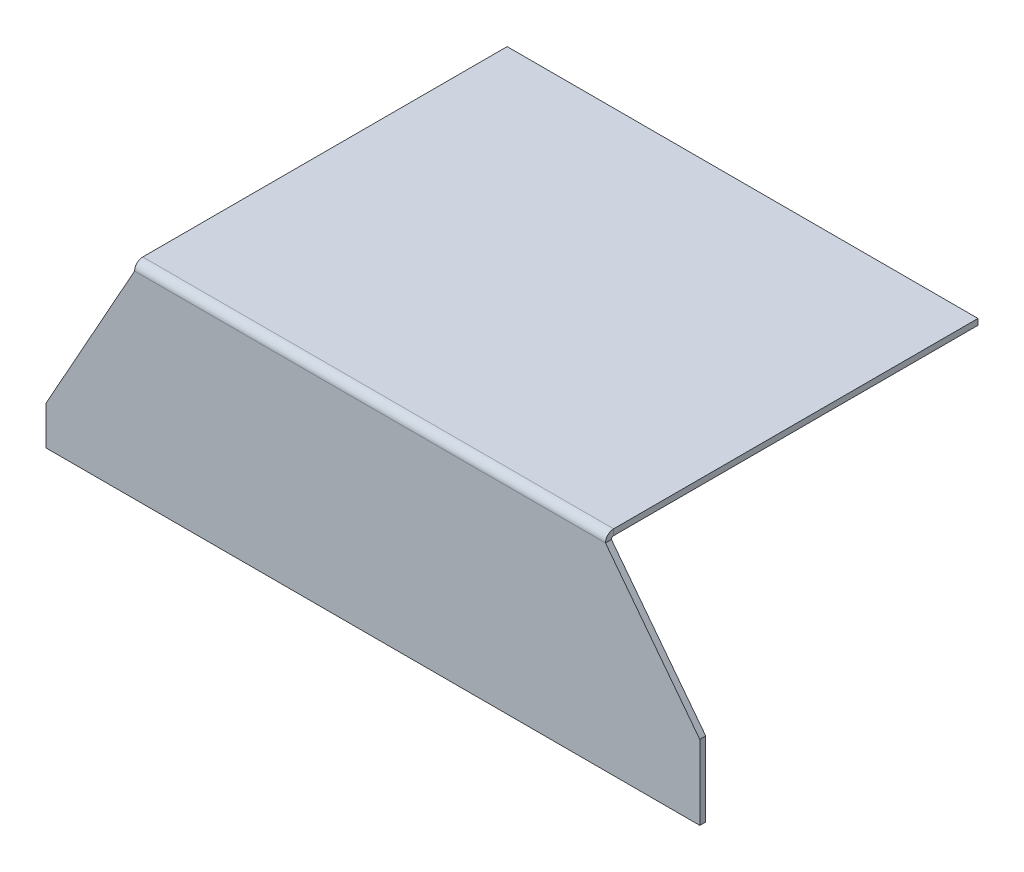
ISO-10303-21;
HEADER;
FILE_DESCRIPTION(('STEP AP214'),'2;1');
FILE_NAME('part.step','',(''),(''),'','','');
FILE_SCHEMA(('AUTOMOTIVE_DESIGN { 1 0 10303 214 1 1 1 1 }'));
ENDSEC;
DATA;
#1=APPLICATION_CONTEXT('core data for automotive mechanical design processes');
#2=APPLICATION_PROTOCOL_DEFINITION('international standard','automotive_design',2000,#1);
#3=PRODUCT_CONTEXT('',#1,'mechanical');
#4=PRODUCT('Part','Part','',(#3));
#5=PRODUCT_RELATED_PRODUCT_CATEGORY('part','',(#4));
#6=PRODUCT_DEFINITION_FORMATION('','',#4);
#7=PRODUCT_DEFINITION_CONTEXT('part definition',#1,'design');
#8=PRODUCT_DEFINITION('design','',#6,#7);
#9=PRODUCT_DEFINITION_SHAPE('','',#8);
#10=(LENGTH_UNIT() NAMED_UNIT(*) SI_UNIT(.MILLI.,.METRE.));
#11=(NAMED_UNIT(*) PLANE_ANGLE_UNIT() SI_UNIT($,.RADIAN.));
#12=(NAMED_UNIT(*) SI_UNIT($,.STERADIAN.) SOLID_ANGLE_UNIT());
#13=UNCERTAINTY_MEASURE_WITH_UNIT(LENGTH_MEASURE(1.E-05),#10,'distance_accuracy_value','');
#14=(GEOMETRIC_REPRESENTATION_CONTEXT(3) GLOBAL_UNCERTAINTY_ASSIGNED_CONTEXT((#13)) GLOBAL_UNIT_ASSIGNED_CONTEXT((#10,
#11,#12)) REPRESENTATION_CONTEXT('',''));
#15=CARTESIAN_POINT('',(0.,0.,0.));
#16=DIRECTION('',(0.,0.,1.));
#17=DIRECTION('',(1.,0.,0.));
#18=AXIS2_PLACEMENT_3D('',#15,#16,#17);
#19=CARTESIAN_POINT('',(-79.,-2.,62.5));
#20=DIRECTION('',(-1.,0.,0.));
#21=DIRECTION('',(0.,0.,1.));
#22=AXIS2_PLACEMENT_3D('',#19,#20,#21);
#23=PLANE('',#22);
#24=DIRECTION('',(0.,0.,1.));
#25=VECTOR('',#24,1.);
#26=CARTESIAN_POINT('',(-79.,-2.,62.5));
#27=LINE('',#26,#25);
#28=CARTESIAN_POINT('',(-79.,-2.,-62.5));
#29=VERTEX_POINT('',#28);
#30=CARTESIAN_POINT('',(-79.,-2.,59.7634));
#31=VERTEX_POINT('',#30);
#32=EDGE_CURVE('E224',#29,#31,#27,.T.);
#33=ORIENTED_EDGE('',*,*,#32,.T.);
#34=DIRECTION('',(0.,1.,0.));
#35=VECTOR('',#34,1.);
#36=CARTESIAN_POINT('',(-79.,-2.00000000000001,59.7634));
#37=LINE('',#36,#35);
#38=CARTESIAN_POINT('',(-79.,0.,59.7634));
#39=VERTEX_POINT('',#38);
#40=EDGE_CURVE('E206',#31,#39,#37,.T.);
#41=ORIENTED_EDGE('',*,*,#40,.T.);
#42=DIRECTION('',(0.,0.,1.));
#43=VECTOR('',#42,1.);
#44=CARTESIAN_POINT('',(-79.,0.,62.5));
#45=LINE('',#44,#43);
#46=CARTESIAN_POINT('',(-79.,0.,-62.5));
#47=VERTEX_POINT('',#46);
#48=EDGE_CURVE('E221',#47,#39,#45,.T.);
#49=ORIENTED_EDGE('',*,*,#48,.F.);
#50=DIRECTION('',(0.,1.,0.));
#51=VECTOR('',#50,1.);
#52=CARTESIAN_POINT('',(-79.,-2.,-62.5));
#53=LINE('',#52,#51);
#54=EDGE_CURVE('E13',#29,#47,#53,.T.);
#55=ORIENTED_EDGE('',*,*,#54,.F.);
#56=EDGE_LOOP('',(#33,#41,#49,#55));
#57=FACE_BOUND('',#56,.T.);
#58=ADVANCED_FACE('F61',(#57),#23,.T.);
#59=CARTESIAN_POINT('',(0.,-2.,0.));
#60=DIRECTION('',(0.,-1.,0.));
#61=DIRECTION('',(0.,0.,-1.));
#62=AXIS2_PLACEMENT_3D('',#59,#60,#61);
#63=PLANE('',#62);
#64=DIRECTION('',(0.,0.,-1.));
#65=VECTOR('',#64,1.);
#66=CARTESIAN_POINT('',(79.,-2.,62.5));
#67=LINE('',#66,#65);
#68=CARTESIAN_POINT('',(79.,-2.,59.7634));
#69=VERTEX_POINT('',#68);
#70=CARTESIAN_POINT('',(79.,-2.,-62.5));
#71=VERTEX_POINT('',#70);
#72=EDGE_CURVE('E218',#69,#71,#67,.T.);
#73=ORIENTED_EDGE('',*,*,#72,.F.);
#74=DIRECTION('',(-1.,0.,0.));
#75=VECTOR('',#74,1.);
#76=CARTESIAN_POINT('',(-79.,-2.00000000000001,59.7634));
#77=LINE('',#76,#75);
#78=EDGE_CURVE('E76',#31,#69,#77,.F.);
#79=ORIENTED_EDGE('',*,*,#78,.F.);
#80=ORIENTED_EDGE('',*,*,#32,.F.);
#81=DIRECTION('',(-1.,0.,0.));
#82=VECTOR('',#81,1.);
#83=CARTESIAN_POINT('',(-79.,-2.,-62.5));
#84=LINE('',#83,#82);
#85=EDGE_CURVE('E220',#71,#29,#84,.T.);
#86=ORIENTED_EDGE('',*,*,#85,.F.);
#87=EDGE_LOOP('',(#73,#79,#80,#86));
#88=FACE_BOUND('',#87,.T.);
#89=ADVANCED_FACE('F274',(#88),#63,.T.);
#90=CARTESIAN_POINT('',(0.,0.,0.));
#91=DIRECTION('',(0.,-1.,0.));
#92=DIRECTION('',(0.,0.,-1.));
#93=AXIS2_PLACEMENT_3D('',#90,#91,#92);
#94=PLANE('',#93);
#95=DIRECTION('',(-1.,0.,0.));
#96=VECTOR('',#95,1.);
#97=CARTESIAN_POINT('',(-79.,0.,59.7634));
#98=LINE('',#97,#96);
#99=CARTESIAN_POINT('',(79.,0.,59.7634));
#100=VERTEX_POINT('',#99);
#101=EDGE_CURVE('E200',#39,#100,#98,.F.);
#102=ORIENTED_EDGE('',*,*,#101,.T.);
#103=DIRECTION('',(0.,0.,-1.));
#104=VECTOR('',#103,1.);
#105=CARTESIAN_POINT('',(79.,0.,62.5));
#106=LINE('',#105,#104);
#107=CARTESIAN_POINT('',(79.,0.,-62.5));
#108=VERTEX_POINT('',#107);
#109=EDGE_CURVE('E216',#100,#108,#106,.T.);
#110=ORIENTED_EDGE('',*,*,#109,.T.);
#111=DIRECTION('',(-1.,0.,0.));
#112=VECTOR('',#111,1.);
#113=CARTESIAN_POINT('',(-79.,0.,-62.5));
#114=LINE('',#113,#112);
#115=EDGE_CURVE('E227',#108,#47,#114,.T.);
#116=ORIENTED_EDGE('',*,*,#115,.T.);
#117=ORIENTED_EDGE('',*,*,#48,.T.);
#118=EDGE_LOOP('',(#102,#110,#116,#117));
#119=FACE_BOUND('',#118,.T.);
#120=ADVANCED_FACE('F234',(#119),#94,.F.);
#121=CARTESIAN_POINT('',(79.,-2.,62.5));
#122=DIRECTION('',(1.,0.,0.));
#123=DIRECTION('',(0.,0.,-1.));
#124=AXIS2_PLACEMENT_3D('',#121,#122,#123);
#125=PLANE('',#124);
#126=DIRECTION('',(0.,1.,0.));
#127=VECTOR('',#126,1.);
#128=CARTESIAN_POINT('',(78.9999999999999,-2.00000000000001,59.7634));
#129=LINE('',#128,#127);
#130=EDGE_CURVE('E84',#69,#100,#129,.T.);
#131=ORIENTED_EDGE('',*,*,#130,.F.);
#132=ORIENTED_EDGE('',*,*,#72,.T.);
#133=DIRECTION('',(0.,1.,0.));
#134=VECTOR('',#133,1.);
#135=CARTESIAN_POINT('',(79.,-2.,-62.5));
#136=LINE('',#135,#134);
#137=EDGE_CURVE('E65',#71,#108,#136,.T.);
#138=ORIENTED_EDGE('',*,*,#137,.T.);
#139=ORIENTED_EDGE('',*,*,#109,.F.);
#140=EDGE_LOOP('',(#131,#132,#138,#139));
#141=FACE_BOUND('',#140,.T.);
#142=ADVANCED_FACE('F63',(#141),#125,.T.);
#143=CARTESIAN_POINT('',(-79.,-2.,-62.5));
#144=DIRECTION('',(0.,0.,-1.));
#145=DIRECTION('',(-1.,0.,0.));
#146=AXIS2_PLACEMENT_3D('',#143,#144,#145);
#147=PLANE('',#146);
#148=ORIENTED_EDGE('',*,*,#115,.F.);
#149=ORIENTED_EDGE('',*,*,#137,.F.);
#150=ORIENTED_EDGE('',*,*,#85,.T.);
#151=ORIENTED_EDGE('',*,*,#54,.T.);
#152=EDGE_LOOP('',(#148,#149,#150,#151));
#153=FACE_BOUND('',#152,.T.);
#154=ADVANCED_FACE('F263',(#153),#147,.T.);
#155=CARTESIAN_POINT('',(78.9999999999999,-2.73660000000001,59.7634));
#156=DIRECTION('',(1.,0.,0.));
#157=DIRECTION('',(0.,0.,-1.));
#158=AXIS2_PLACEMENT_3D('',#155,#156,#157);
#159=PLANE('',#158);
#160=DIRECTION('',(0.,0.,1.));
#161=VECTOR('',#160,1.);
#162=CARTESIAN_POINT('',(79.,-2.73660000000001,62.5000000000002));
#163=LINE('',#162,#161);
#164=CARTESIAN_POINT('',(78.9999999999999,-2.7366,60.5));
#165=VERTEX_POINT('',#164);
#166=CARTESIAN_POINT('',(78.9999999999999,-2.7366,62.5));
#167=VERTEX_POINT('',#166);
#168=EDGE_CURVE('E184',#165,#167,#163,.T.);
#169=ORIENTED_EDGE('',*,*,#168,.F.);
#170=CARTESIAN_POINT('',(78.9999999999999,-2.73660000000001,59.7634));
#171=DIRECTION('',(-1.,0.,0.));
#172=DIRECTION('',(0.,0.,1.));
#173=AXIS2_PLACEMENT_3D('',#170,#171,#172);
#174=CIRCLE('',#173,0.736599999999997);
#175=EDGE_CURVE('E209',#69,#165,#174,.F.);
#176=ORIENTED_EDGE('',*,*,#175,.F.);
#177=ORIENTED_EDGE('',*,*,#130,.T.);
#178=CARTESIAN_POINT('',(78.9999999999999,-2.73660000000001,59.7634));
#179=DIRECTION('',(-1.,0.,0.));
#180=DIRECTION('',(0.,0.,1.));
#181=AXIS2_PLACEMENT_3D('',#178,#179,#180);
#182=CIRCLE('',#181,2.7366);
#183=EDGE_CURVE('E202',#100,#167,#182,.F.);
#184=ORIENTED_EDGE('',*,*,#183,.T.);
#185=EDGE_LOOP('',(#169,#176,#177,#184));
#186=FACE_BOUND('',#185,.T.);
#187=ADVANCED_FACE('F261',(#186),#159,.T.);
#188=CARTESIAN_POINT('',(-79.,-2.73660000000001,59.7634));
#189=DIRECTION('',(1.,0.,0.));
#190=DIRECTION('',(0.,0.,-1.));
#191=AXIS2_PLACEMENT_3D('',#188,#189,#190);
#192=PLANE('',#191);
#193=CARTESIAN_POINT('',(-79.,-2.73660000000001,59.7634));
#194=DIRECTION('',(-1.,0.,0.));
#195=DIRECTION('',(0.,0.,1.));
#196=AXIS2_PLACEMENT_3D('',#193,#194,#195);
#197=CIRCLE('',#196,0.736599999999997);
#198=CARTESIAN_POINT('',(-79.,-2.7366,60.5));
#199=VERTEX_POINT('',#198);
#200=EDGE_CURVE('E191',#199,#31,#197,.T.);
#201=ORIENTED_EDGE('',*,*,#200,.F.);
#202=DIRECTION('',(0.,0.,1.));
#203=VECTOR('',#202,1.);
#204=CARTESIAN_POINT('',(-79.,-2.73660000000001,60.5));
#205=LINE('',#204,#203);
#206=CARTESIAN_POINT('',(-79.,-2.73660000000001,62.5));
#207=VERTEX_POINT('',#206);
#208=EDGE_CURVE('E166',#199,#207,#205,.T.);
#209=ORIENTED_EDGE('',*,*,#208,.T.);
#210=CARTESIAN_POINT('',(-79.,-2.73660000000001,59.7634));
#211=DIRECTION('',(-1.,0.,0.));
#212=DIRECTION('',(0.,0.,1.));
#213=AXIS2_PLACEMENT_3D('',#210,#211,#212);
#214=CIRCLE('',#213,2.7366);
#215=EDGE_CURVE('E203',#207,#39,#214,.T.);
#216=ORIENTED_EDGE('',*,*,#215,.T.);
#217=ORIENTED_EDGE('',*,*,#40,.F.);
#218=EDGE_LOOP('',(#201,#209,#216,#217));
#219=FACE_BOUND('',#218,.T.);
#220=ADVANCED_FACE('F244',(#219),#192,.F.);
#221=CARTESIAN_POINT('',(-79.,-2.73660000000001,59.7634));
#222=DIRECTION('',(-1.,0.,0.));
#223=DIRECTION('',(0.,0.,1.));
#224=AXIS2_PLACEMENT_3D('',#221,#222,#223);
#225=CYLINDRICAL_SURFACE('',#224,2.7366);
#226=ORIENTED_EDGE('',*,*,#101,.F.);
#227=ORIENTED_EDGE('',*,*,#215,.F.);
#228=DIRECTION('',(-1.,0.,0.));
#229=VECTOR('',#228,1.);
#230=CARTESIAN_POINT('',(0.,-2.73660000000001,62.5));
#231=LINE('',#230,#229);
#232=EDGE_CURVE('E193',#167,#207,#231,.T.);
#233=ORIENTED_EDGE('',*,*,#232,.F.);
#234=ORIENTED_EDGE('',*,*,#183,.F.);
#235=EDGE_LOOP('',(#226,#227,#233,#234));
#236=FACE_BOUND('',#235,.T.);
#237=ADVANCED_FACE('F240',(#236),#225,.T.);
#238=CARTESIAN_POINT('',(-79.,-2.73660000000001,59.7634));
#239=DIRECTION('',(-1.,0.,0.));
#240=DIRECTION('',(0.,0.,1.));
#241=AXIS2_PLACEMENT_3D('',#238,#239,#240);
#242=CYLINDRICAL_SURFACE('',#241,0.736599999999997);
#243=ORIENTED_EDGE('',*,*,#78,.T.);
#244=ORIENTED_EDGE('',*,*,#175,.T.);
#245=DIRECTION('',(1.,0.,0.));
#246=VECTOR('',#245,1.);
#247=CARTESIAN_POINT('',(79.,-2.73660000000001,60.5));
#248=LINE('',#247,#246);
#249=EDGE_CURVE('E196',#165,#199,#248,.F.);
#250=ORIENTED_EDGE('',*,*,#249,.T.);
#251=ORIENTED_EDGE('',*,*,#200,.T.);
#252=EDGE_LOOP('',(#243,#244,#250,#251));
#253=FACE_BOUND('',#252,.T.);
#254=ADVANCED_FACE('F246',(#253),#242,.F.);
#255=CARTESIAN_POINT('',(0.,2.27059821570266E-13,62.5));
#256=DIRECTION('',(0.,0.,1.));
#257=DIRECTION('',(0.,-1.,0.));
#258=AXIS2_PLACEMENT_3D('',#255,#256,#257);
#259=PLANE('',#258);
#260=DIRECTION('',(-1.,0.,0.));
#261=VECTOR('',#260,1.);
#262=CARTESIAN_POINT('',(-79.,-69.,62.5000000000002));
#263=LINE('',#262,#261);
#264=CARTESIAN_POINT('',(110.643827525127,-69.,62.5));
#265=VERTEX_POINT('',#264);
#266=CARTESIAN_POINT('',(-108.732309369438,-69.,62.5));
#267=VERTEX_POINT('',#266);
#268=EDGE_CURVE('E189',#265,#267,#263,.T.);
#269=ORIENTED_EDGE('',*,*,#268,.F.);
#270=DIRECTION('',(0.,1.,0.));
#271=VECTOR('',#270,1.);
#272=CARTESIAN_POINT('',(110.643827525127,-69.,62.5));
#273=LINE('',#272,#271);
#274=CARTESIAN_POINT('',(110.643827525127,-44.,62.5));
#275=VERTEX_POINT('',#274);
#276=EDGE_CURVE('E170',#265,#275,#273,.T.);
#277=ORIENTED_EDGE('',*,*,#276,.T.);
#278=DIRECTION('',(-0.608535144713985,0.793526923076923,0.));
#279=VECTOR('',#278,1.);
#280=CARTESIAN_POINT('',(110.643827525127,-44.,62.5));
#281=LINE('',#280,#279);
#282=EDGE_CURVE('E167',#275,#167,#281,.T.);
#283=ORIENTED_EDGE('',*,*,#282,.T.);
#284=ORIENTED_EDGE('',*,*,#232,.T.);
#285=DIRECTION('',(-0.487414907695713,-0.873170491803279,0.));
#286=VECTOR('',#285,1.);
#287=CARTESIAN_POINT('',(-79.,-2.73660000000001,62.5));
#288=LINE('',#287,#286);
#289=CARTESIAN_POINT('',(-108.732309369438,-56.,62.5));
#290=VERTEX_POINT('',#289);
#291=EDGE_CURVE('E177',#207,#290,#288,.T.);
#292=ORIENTED_EDGE('',*,*,#291,.T.);
#293=DIRECTION('',(0.,-1.,0.));
#294=VECTOR('',#293,1.);
#295=CARTESIAN_POINT('',(-108.732309369438,-56.,62.5));
#296=LINE('',#295,#294);
#297=EDGE_CURVE('E145',#290,#267,#296,.T.);
#298=ORIENTED_EDGE('',*,*,#297,.T.);
#299=EDGE_LOOP('',(#269,#277,#283,#284,#292,#298));
#300=FACE_BOUND('',#299,.T.);
#301=ADVANCED_FACE('F259',(#300),#259,.T.);
#302=CARTESIAN_POINT('',(0.,2.2007685889258E-13,60.5));
#303=DIRECTION('',(0.,0.,1.));
#304=DIRECTION('',(0.,-1.,0.));
#305=AXIS2_PLACEMENT_3D('',#302,#303,#304);
#306=PLANE('',#305);
#307=ORIENTED_EDGE('',*,*,#249,.F.);
#308=DIRECTION('',(-0.608535144713985,0.793526923076923,0.));
#309=VECTOR('',#308,1.);
#310=CARTESIAN_POINT('',(110.643827525127,-44.,60.5));
#311=LINE('',#310,#309);
#312=CARTESIAN_POINT('',(110.643827525127,-44.,60.5));
#313=VERTEX_POINT('',#312);
#314=EDGE_CURVE('E151',#313,#165,#311,.T.);
#315=ORIENTED_EDGE('',*,*,#314,.F.);
#316=DIRECTION('',(0.,1.,0.));
#317=VECTOR('',#316,1.);
#318=CARTESIAN_POINT('',(110.643827525127,-69.,60.5));
#319=LINE('',#318,#317);
#320=CARTESIAN_POINT('',(110.643827525127,-69.,60.5));
#321=VERTEX_POINT('',#320);
#322=EDGE_CURVE('E161',#321,#313,#319,.T.);
#323=ORIENTED_EDGE('',*,*,#322,.F.);
#324=DIRECTION('',(1.,0.,0.));
#325=VECTOR('',#324,1.);
#326=CARTESIAN_POINT('',(0.,-69.,60.5000000000002));
#327=LINE('',#326,#325);
#328=CARTESIAN_POINT('',(-108.732309369438,-69.,60.5));
#329=VERTEX_POINT('',#328);
#330=EDGE_CURVE('E159',#321,#329,#327,.F.);
#331=ORIENTED_EDGE('',*,*,#330,.T.);
#332=DIRECTION('',(0.,-1.,0.));
#333=VECTOR('',#332,1.);
#334=CARTESIAN_POINT('',(-108.732309369438,-56.,60.5));
#335=LINE('',#334,#333);
#336=CARTESIAN_POINT('',(-108.732309369438,-56.,60.5));
#337=VERTEX_POINT('',#336);
#338=EDGE_CURVE('E143',#337,#329,#335,.T.);
#339=ORIENTED_EDGE('',*,*,#338,.F.);
#340=DIRECTION('',(-0.487414907695713,-0.873170491803279,0.));
#341=VECTOR('',#340,1.);
#342=CARTESIAN_POINT('',(-79.,-2.73660000000001,60.5));
#343=LINE('',#342,#341);
#344=EDGE_CURVE('E157',#199,#337,#343,.T.);
#345=ORIENTED_EDGE('',*,*,#344,.F.);
#346=EDGE_LOOP('',(#307,#315,#323,#331,#339,#345));
#347=FACE_BOUND('',#346,.T.);
#348=ADVANCED_FACE('F156',(#347),#306,.F.);
#349=CARTESIAN_POINT('',(-79.,-69.,62.5000000000002));
#350=DIRECTION('',(0.,-1.,0.));
#351=DIRECTION('',(0.,0.,-1.));
#352=AXIS2_PLACEMENT_3D('',#349,#350,#351);
#353=PLANE('',#352);
#354=ORIENTED_EDGE('',*,*,#330,.F.);
#355=DIRECTION('',(0.,0.,1.));
#356=VECTOR('',#355,1.);
#357=CARTESIAN_POINT('',(110.643827525127,-69.,60.5));
#358=LINE('',#357,#356);
#359=EDGE_CURVE('E185',#321,#265,#358,.T.);
#360=ORIENTED_EDGE('',*,*,#359,.T.);
#361=ORIENTED_EDGE('',*,*,#268,.T.);
#362=DIRECTION('',(0.,0.,1.));
#363=VECTOR('',#362,1.);
#364=CARTESIAN_POINT('',(-108.732309369438,-69.,60.5));
#365=LINE('',#364,#363);
#366=EDGE_CURVE('E150',#329,#267,#365,.T.);
#367=ORIENTED_EDGE('',*,*,#366,.F.);
#368=EDGE_LOOP('',(#354,#360,#361,#367));
#369=FACE_BOUND('',#368,.T.);
#370=ADVANCED_FACE('F257',(#369),#353,.T.);
#371=CARTESIAN_POINT('',(110.643827525127,-69.,60.5));
#372=DIRECTION('',(1.,0.,0.));
#373=DIRECTION('',(0.,0.,-1.));
#374=AXIS2_PLACEMENT_3D('',#371,#372,#373);
#375=PLANE('',#374);
#376=ORIENTED_EDGE('',*,*,#276,.F.);
#377=ORIENTED_EDGE('',*,*,#359,.F.);
#378=ORIENTED_EDGE('',*,*,#322,.T.);
#379=DIRECTION('',(0.,0.,1.));
#380=VECTOR('',#379,1.);
#381=CARTESIAN_POINT('',(110.643827525127,-44.,60.5));
#382=LINE('',#381,#380);
#383=EDGE_CURVE('E182',#313,#275,#382,.T.);
#384=ORIENTED_EDGE('',*,*,#383,.T.);
#385=EDGE_LOOP('',(#376,#377,#378,#384));
#386=FACE_BOUND('',#385,.T.);
#387=ADVANCED_FACE('F255',(#386),#375,.T.);
#388=CARTESIAN_POINT('',(110.643827525127,-44.,60.5));
#389=DIRECTION('',(0.793526923076923,0.608535144713985,0.));
#390=DIRECTION('',(-0.608535144713985,0.793526923076923,0.));
#391=AXIS2_PLACEMENT_3D('',#388,#389,#390);
#392=PLANE('',#391);
#393=ORIENTED_EDGE('',*,*,#282,.F.);
#394=ORIENTED_EDGE('',*,*,#383,.F.);
#395=ORIENTED_EDGE('',*,*,#314,.T.);
#396=ORIENTED_EDGE('',*,*,#168,.T.);
#397=EDGE_LOOP('',(#393,#394,#395,#396));
#398=FACE_BOUND('',#397,.T.);
#399=ADVANCED_FACE('F251',(#398),#392,.T.);
#400=CARTESIAN_POINT('',(-108.732309369438,-56.,60.5));
#401=DIRECTION('',(-1.,0.,0.));
#402=DIRECTION('',(0.,0.,1.));
#403=AXIS2_PLACEMENT_3D('',#400,#401,#402);
#404=PLANE('',#403);
#405=ORIENTED_EDGE('',*,*,#297,.F.);
#406=DIRECTION('',(0.,0.,1.));
#407=VECTOR('',#406,1.);
#408=CARTESIAN_POINT('',(-108.732309369438,-56.,60.5));
#409=LINE('',#408,#407);
#410=EDGE_CURVE('E139',#337,#290,#409,.T.);
#411=ORIENTED_EDGE('',*,*,#410,.F.);
#412=ORIENTED_EDGE('',*,*,#338,.T.);
#413=ORIENTED_EDGE('',*,*,#366,.T.);
#414=EDGE_LOOP('',(#405,#411,#412,#413));
#415=FACE_BOUND('',#414,.T.);
#416=ADVANCED_FACE('F141',(#415),#404,.T.);
#417=CARTESIAN_POINT('',(-79.,-2.73660000000001,60.5));
#418=DIRECTION('',(-0.873170491803279,0.487414907695713,0.));
#419=DIRECTION('',(-0.487414907695713,-0.873170491803279,0.));
#420=AXIS2_PLACEMENT_3D('',#417,#418,#419);
#421=PLANE('',#420);
#422=ORIENTED_EDGE('',*,*,#291,.F.);
#423=ORIENTED_EDGE('',*,*,#208,.F.);
#424=ORIENTED_EDGE('',*,*,#344,.T.);
#425=ORIENTED_EDGE('',*,*,#410,.T.);
#426=EDGE_LOOP('',(#422,#423,#424,#425));
#427=FACE_BOUND('',#426,.T.);
#428=ADVANCED_FACE('F164',(#427),#421,.T.);
#429=CLOSED_SHELL('',(#58,#89,#120,#142,#154,#187,#220,#237,#254,#301,#348,#370,#387,#399,#416,#428));
#430=MANIFOLD_SOLID_BREP('B2',#429);
#431=ADVANCED_BREP_SHAPE_REPRESENTATION('',(#18,#430),#14);
#432=SHAPE_DEFINITION_REPRESENTATION(#9,#431);
ENDSEC;
END-ISO-10303-21;
